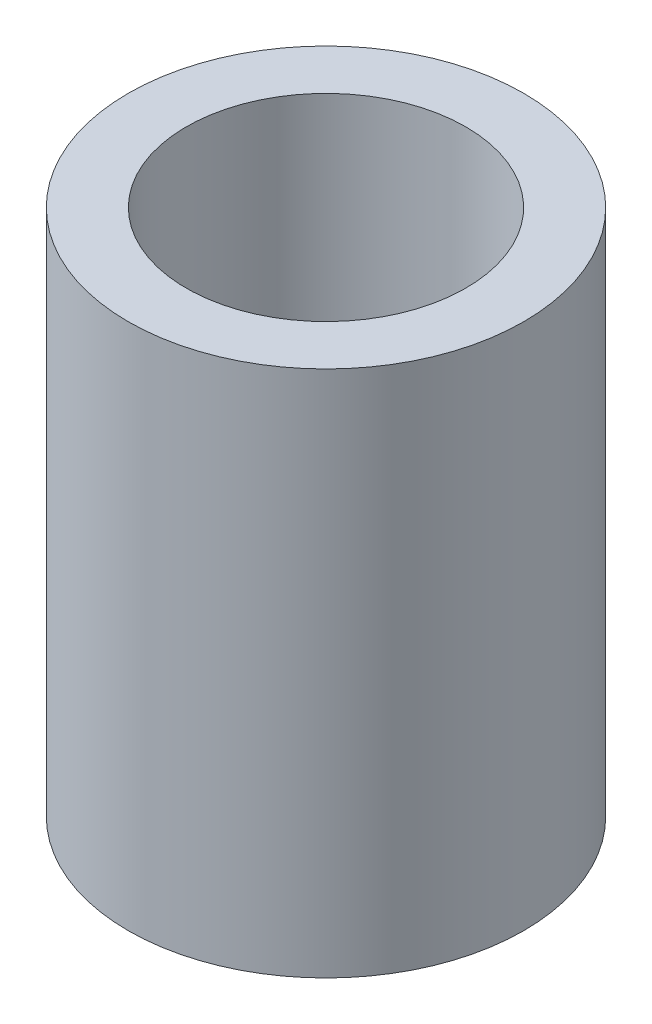
ISO-10303-21;
HEADER;
FILE_DESCRIPTION(('STEP AP214'),'2;1');
FILE_NAME('part.step','',(''),(''),'','','');
FILE_SCHEMA(('AUTOMOTIVE_DESIGN { 1 0 10303 214 1 1 1 1 }'));
ENDSEC;
DATA;
#1=APPLICATION_CONTEXT('core data for automotive mechanical design processes');
#2=APPLICATION_PROTOCOL_DEFINITION('international standard','automotive_design',2000,#1);
#3=PRODUCT_CONTEXT('',#1,'mechanical');
#4=PRODUCT('Part','Part','',(#3));
#5=PRODUCT_RELATED_PRODUCT_CATEGORY('part','',(#4));
#6=PRODUCT_DEFINITION_FORMATION('','',#4);
#7=PRODUCT_DEFINITION_CONTEXT('part definition',#1,'design');
#8=PRODUCT_DEFINITION('design','',#6,#7);
#9=PRODUCT_DEFINITION_SHAPE('','',#8);
#10=(LENGTH_UNIT() NAMED_UNIT(*) SI_UNIT(.MILLI.,.METRE.));
#11=(NAMED_UNIT(*) PLANE_ANGLE_UNIT() SI_UNIT($,.RADIAN.));
#12=(NAMED_UNIT(*) SI_UNIT($,.STERADIAN.) SOLID_ANGLE_UNIT());
#13=UNCERTAINTY_MEASURE_WITH_UNIT(LENGTH_MEASURE(1.E-05),#10,'distance_accuracy_value','');
#14=(GEOMETRIC_REPRESENTATION_CONTEXT(3) GLOBAL_UNCERTAINTY_ASSIGNED_CONTEXT((#13)) GLOBAL_UNIT_ASSIGNED_CONTEXT((#10,
#11,#12)) REPRESENTATION_CONTEXT('',''));
#15=CARTESIAN_POINT('',(0.,0.,0.));
#16=DIRECTION('',(0.,0.,1.));
#17=DIRECTION('',(1.,0.,0.));
#18=AXIS2_PLACEMENT_3D('',#15,#16,#17);
#19=CARTESIAN_POINT('',(0.,12.7,0.));
#20=DIRECTION('',(0.,-1.,0.));
#21=DIRECTION('',(0.,0.,-1.));
#22=AXIS2_PLACEMENT_3D('',#19,#20,#21);
#23=CYLINDRICAL_SURFACE('',#22,3.3655);
#24=CARTESIAN_POINT('',(0.,0.,0.));
#25=DIRECTION('',(0.,-1.,0.));
#26=DIRECTION('',(0.,0.,-1.));
#27=AXIS2_PLACEMENT_3D('',#24,#25,#26);
#28=CIRCLE('',#27,3.3655);
#29=CARTESIAN_POINT('',(0.,0.,-3.3655));
#30=VERTEX_POINT('',#29);
#31=EDGE_CURVE('E27',#30,#30,#28,.T.);
#32=ORIENTED_EDGE('',*,*,#31,.T.);
#33=EDGE_LOOP('',(#32));
#34=FACE_BOUND('',#33,.T.);
#35=CARTESIAN_POINT('',(0.,12.7,0.));
#36=DIRECTION('',(0.,-1.,0.));
#37=DIRECTION('',(0.,0.,-1.));
#38=AXIS2_PLACEMENT_3D('',#35,#36,#37);
#39=CIRCLE('',#38,3.3655);
#40=CARTESIAN_POINT('',(0.,12.7,-3.3655));
#41=VERTEX_POINT('',#40);
#42=EDGE_CURVE('E36',#41,#41,#39,.T.);
#43=ORIENTED_EDGE('',*,*,#42,.F.);
#44=EDGE_LOOP('',(#43));
#45=FACE_BOUND('',#44,.T.);
#46=ADVANCED_FACE('F15',(#34,#45),#23,.F.);
#47=CARTESIAN_POINT('',(0.,12.7,0.));
#48=DIRECTION('',(0.,1.,0.));
#49=DIRECTION('',(0.,0.,1.));
#50=AXIS2_PLACEMENT_3D('',#47,#48,#49);
#51=PLANE('',#50);
#52=ORIENTED_EDGE('',*,*,#42,.T.);
#53=EDGE_LOOP('',(#52));
#54=FACE_BOUND('',#53,.T.);
#55=CARTESIAN_POINT('',(0.,12.7,0.));
#56=DIRECTION('',(0.,-1.,0.));
#57=DIRECTION('',(0.,0.,-1.));
#58=AXIS2_PLACEMENT_3D('',#55,#56,#57);
#59=CIRCLE('',#58,4.7625);
#60=CARTESIAN_POINT('',(0.,12.7,-4.7625));
#61=VERTEX_POINT('',#60);
#62=EDGE_CURVE('E22',#61,#61,#59,.T.);
#63=ORIENTED_EDGE('',*,*,#62,.F.);
#64=EDGE_LOOP('',(#63));
#65=FACE_BOUND('',#64,.T.);
#66=ADVANCED_FACE('F41',(#54,#65),#51,.T.);
#67=CARTESIAN_POINT('',(0.,0.,0.));
#68=DIRECTION('',(0.,1.,0.));
#69=DIRECTION('',(0.,0.,1.));
#70=AXIS2_PLACEMENT_3D('',#67,#68,#69);
#71=PLANE('',#70);
#72=ORIENTED_EDGE('',*,*,#31,.F.);
#73=EDGE_LOOP('',(#72));
#74=FACE_BOUND('',#73,.T.);
#75=CARTESIAN_POINT('',(0.,0.,0.));
#76=DIRECTION('',(0.,-1.,0.));
#77=DIRECTION('',(0.,0.,-1.));
#78=AXIS2_PLACEMENT_3D('',#75,#76,#77);
#79=CIRCLE('',#78,4.7625);
#80=CARTESIAN_POINT('',(0.,0.,-4.7625));
#81=VERTEX_POINT('',#80);
#82=EDGE_CURVE('E10',#81,#81,#79,.F.);
#83=ORIENTED_EDGE('',*,*,#82,.F.);
#84=EDGE_LOOP('',(#83));
#85=FACE_BOUND('',#84,.T.);
#86=ADVANCED_FACE('F50',(#74,#85),#71,.F.);
#87=CARTESIAN_POINT('',(0.,12.7,0.));
#88=DIRECTION('',(0.,-1.,0.));
#89=DIRECTION('',(0.,0.,-1.));
#90=AXIS2_PLACEMENT_3D('',#87,#88,#89);
#91=CYLINDRICAL_SURFACE('',#90,4.7625);
#92=ORIENTED_EDGE('',*,*,#82,.T.);
#93=EDGE_LOOP('',(#92));
#94=FACE_BOUND('',#93,.T.);
#95=ORIENTED_EDGE('',*,*,#62,.T.);
#96=EDGE_LOOP('',(#95));
#97=FACE_BOUND('',#96,.T.);
#98=ADVANCED_FACE('F51',(#94,#97),#91,.T.);
#99=CLOSED_SHELL('',(#46,#66,#86,#98));
#100=MANIFOLD_SOLID_BREP('B1',#99);
#101=ADVANCED_BREP_SHAPE_REPRESENTATION('',(#18,#100),#14);
#102=SHAPE_DEFINITION_REPRESENTATION(#9,#101);
ENDSEC;
END-ISO-10303-21;
